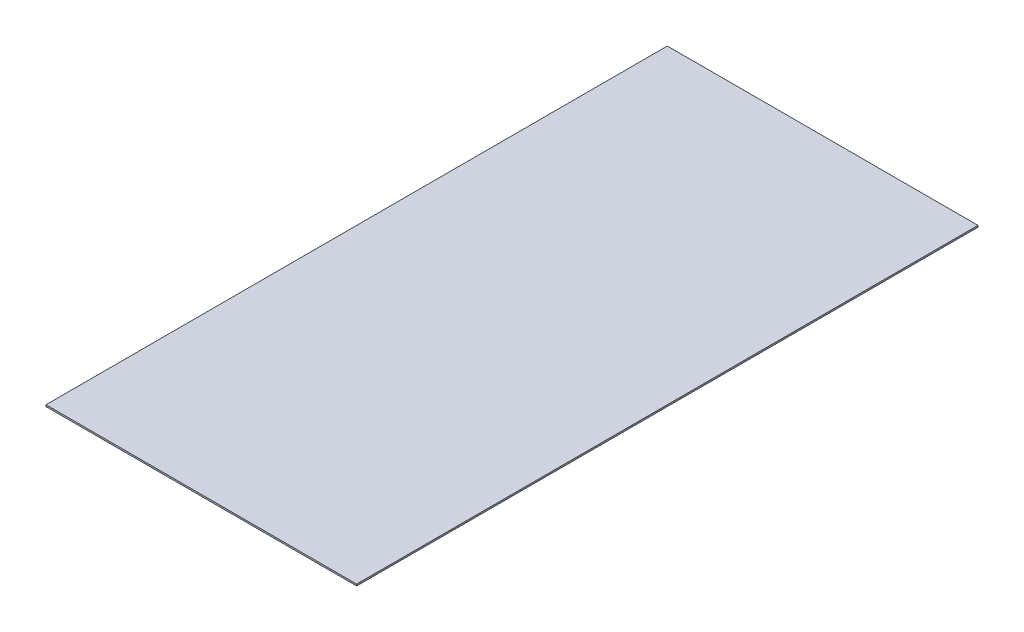
ISO-10303-21;
HEADER;
FILE_DESCRIPTION(('STEP AP214'),'2;1');
FILE_NAME('part.step','',(''),(''),'','','');
FILE_SCHEMA(('AUTOMOTIVE_DESIGN { 1 0 10303 214 1 1 1 1 }'));
ENDSEC;
DATA;
#1=APPLICATION_CONTEXT('core data for automotive mechanical design processes');
#2=APPLICATION_PROTOCOL_DEFINITION('international standard','automotive_design',2000,#1);
#3=PRODUCT_CONTEXT('',#1,'mechanical');
#4=PRODUCT('Part','Part','',(#3));
#5=PRODUCT_RELATED_PRODUCT_CATEGORY('part','',(#4));
#6=PRODUCT_DEFINITION_FORMATION('','',#4);
#7=PRODUCT_DEFINITION_CONTEXT('part definition',#1,'design');
#8=PRODUCT_DEFINITION('design','',#6,#7);
#9=PRODUCT_DEFINITION_SHAPE('','',#8);
#10=(LENGTH_UNIT() NAMED_UNIT(*) SI_UNIT(.MILLI.,.METRE.));
#11=(NAMED_UNIT(*) PLANE_ANGLE_UNIT() SI_UNIT($,.RADIAN.));
#12=(NAMED_UNIT(*) SI_UNIT($,.STERADIAN.) SOLID_ANGLE_UNIT());
#13=UNCERTAINTY_MEASURE_WITH_UNIT(LENGTH_MEASURE(1.E-05),#10,'distance_accuracy_value','');
#14=(GEOMETRIC_REPRESENTATION_CONTEXT(3) GLOBAL_UNCERTAINTY_ASSIGNED_CONTEXT((#13)) GLOBAL_UNIT_ASSIGNED_CONTEXT((#10,
#11,#12)) REPRESENTATION_CONTEXT('',''));
#15=CARTESIAN_POINT('',(0.,0.,0.));
#16=DIRECTION('',(0.,0.,1.));
#17=DIRECTION('',(1.,0.,0.));
#18=AXIS2_PLACEMENT_3D('',#15,#16,#17);
#19=CARTESIAN_POINT('',(609.6,6.4,1219.2));
#20=DIRECTION('',(-1.,0.,0.));
#21=DIRECTION('',(0.,0.,1.));
#22=AXIS2_PLACEMENT_3D('',#19,#20,#21);
#23=PLANE('',#22);
#24=DIRECTION('',(0.,0.,-1.));
#25=VECTOR('',#24,1.);
#26=CARTESIAN_POINT('',(609.6,0.,1219.2));
#27=LINE('',#26,#25);
#28=CARTESIAN_POINT('',(609.6,0.,1219.2));
#29=VERTEX_POINT('',#28);
#30=CARTESIAN_POINT('',(609.6,0.,-1219.2));
#31=VERTEX_POINT('',#30);
#32=EDGE_CURVE('E96',#29,#31,#27,.T.);
#33=ORIENTED_EDGE('',*,*,#32,.T.);
#34=DIRECTION('',(0.,-1.,0.));
#35=VECTOR('',#34,1.);
#36=CARTESIAN_POINT('',(609.6,6.4,-1219.2));
#37=LINE('',#36,#35);
#38=CARTESIAN_POINT('',(609.6,6.4,-1219.2));
#39=VERTEX_POINT('',#38);
#40=EDGE_CURVE('E11',#39,#31,#37,.T.);
#41=ORIENTED_EDGE('',*,*,#40,.F.);
#42=DIRECTION('',(0.,0.,-1.));
#43=VECTOR('',#42,1.);
#44=CARTESIAN_POINT('',(609.6,6.4,1219.2));
#45=LINE('',#44,#43);
#46=CARTESIAN_POINT('',(609.6,6.4,1219.2));
#47=VERTEX_POINT('',#46);
#48=EDGE_CURVE('E84',#47,#39,#45,.T.);
#49=ORIENTED_EDGE('',*,*,#48,.F.);
#50=DIRECTION('',(0.,-1.,0.));
#51=VECTOR('',#50,1.);
#52=CARTESIAN_POINT('',(609.6,6.4,1219.2));
#53=LINE('',#52,#51);
#54=EDGE_CURVE('E92',#47,#29,#53,.T.);
#55=ORIENTED_EDGE('',*,*,#54,.T.);
#56=EDGE_LOOP('',(#33,#41,#49,#55));
#57=FACE_BOUND('',#56,.T.);
#58=ADVANCED_FACE('F33',(#57),#23,.F.);
#59=CARTESIAN_POINT('',(-609.6,6.4,-1219.2));
#60=DIRECTION('',(0.,0.,1.));
#61=DIRECTION('',(1.,0.,0.));
#62=AXIS2_PLACEMENT_3D('',#59,#60,#61);
#63=PLANE('',#62);
#64=DIRECTION('',(-1.,0.,0.));
#65=VECTOR('',#64,1.);
#66=CARTESIAN_POINT('',(-609.6,0.,-1219.2));
#67=LINE('',#66,#65);
#68=CARTESIAN_POINT('',(-609.6,0.,-1219.2));
#69=VERTEX_POINT('',#68);
#70=EDGE_CURVE('E88',#31,#69,#67,.T.);
#71=ORIENTED_EDGE('',*,*,#70,.T.);
#72=DIRECTION('',(0.,-1.,0.));
#73=VECTOR('',#72,1.);
#74=CARTESIAN_POINT('',(-609.6,6.4,-1219.2));
#75=LINE('',#74,#73);
#76=CARTESIAN_POINT('',(-609.6,6.4,-1219.2));
#77=VERTEX_POINT('',#76);
#78=EDGE_CURVE('E41',#77,#69,#75,.T.);
#79=ORIENTED_EDGE('',*,*,#78,.F.);
#80=DIRECTION('',(-1.,0.,0.));
#81=VECTOR('',#80,1.);
#82=CARTESIAN_POINT('',(-609.6,6.4,-1219.2));
#83=LINE('',#82,#81);
#84=EDGE_CURVE('E79',#39,#77,#83,.T.);
#85=ORIENTED_EDGE('',*,*,#84,.F.);
#86=ORIENTED_EDGE('',*,*,#40,.T.);
#87=EDGE_LOOP('',(#71,#79,#85,#86));
#88=FACE_BOUND('',#87,.T.);
#89=ADVANCED_FACE('F87',(#88),#63,.F.);
#90=CARTESIAN_POINT('',(-609.6,6.4,1219.2));
#91=DIRECTION('',(1.,0.,0.));
#92=DIRECTION('',(0.,0.,-1.));
#93=AXIS2_PLACEMENT_3D('',#90,#91,#92);
#94=PLANE('',#93);
#95=DIRECTION('',(0.,0.,1.));
#96=VECTOR('',#95,1.);
#97=CARTESIAN_POINT('',(-609.6,0.,1219.2));
#98=LINE('',#97,#96);
#99=CARTESIAN_POINT('',(-609.6,0.,1219.2));
#100=VERTEX_POINT('',#99);
#101=EDGE_CURVE('E66',#69,#100,#98,.T.);
#102=ORIENTED_EDGE('',*,*,#101,.T.);
#103=DIRECTION('',(0.,-1.,0.));
#104=VECTOR('',#103,1.);
#105=CARTESIAN_POINT('',(-609.6,6.4,1219.2));
#106=LINE('',#105,#104);
#107=CARTESIAN_POINT('',(-609.6,6.4,1219.2));
#108=VERTEX_POINT('',#107);
#109=EDGE_CURVE('E89',#108,#100,#106,.T.);
#110=ORIENTED_EDGE('',*,*,#109,.F.);
#111=DIRECTION('',(0.,0.,1.));
#112=VECTOR('',#111,1.);
#113=CARTESIAN_POINT('',(-609.6,6.4,1219.2));
#114=LINE('',#113,#112);
#115=EDGE_CURVE('E82',#77,#108,#114,.T.);
#116=ORIENTED_EDGE('',*,*,#115,.F.);
#117=ORIENTED_EDGE('',*,*,#78,.T.);
#118=EDGE_LOOP('',(#102,#110,#116,#117));
#119=FACE_BOUND('',#118,.T.);
#120=ADVANCED_FACE('F90',(#119),#94,.F.);
#121=CARTESIAN_POINT('',(-609.6,6.4,1219.2));
#122=DIRECTION('',(0.,0.,-1.));
#123=DIRECTION('',(-1.,0.,0.));
#124=AXIS2_PLACEMENT_3D('',#121,#122,#123);
#125=PLANE('',#124);
#126=DIRECTION('',(1.,0.,0.));
#127=VECTOR('',#126,1.);
#128=CARTESIAN_POINT('',(-609.6,0.,1219.2));
#129=LINE('',#128,#127);
#130=EDGE_CURVE('E72',#100,#29,#129,.T.);
#131=ORIENTED_EDGE('',*,*,#130,.T.);
#132=ORIENTED_EDGE('',*,*,#54,.F.);
#133=DIRECTION('',(1.,0.,0.));
#134=VECTOR('',#133,1.);
#135=CARTESIAN_POINT('',(-609.6,6.4,1219.2));
#136=LINE('',#135,#134);
#137=EDGE_CURVE('E49',#108,#47,#136,.T.);
#138=ORIENTED_EDGE('',*,*,#137,.F.);
#139=ORIENTED_EDGE('',*,*,#109,.T.);
#140=EDGE_LOOP('',(#131,#132,#138,#139));
#141=FACE_BOUND('',#140,.T.);
#142=ADVANCED_FACE('F103',(#141),#125,.F.);
#143=CARTESIAN_POINT('',(0.,6.4,0.));
#144=DIRECTION('',(0.,-1.,0.));
#145=DIRECTION('',(0.,0.,-1.));
#146=AXIS2_PLACEMENT_3D('',#143,#144,#145);
#147=PLANE('',#146);
#148=ORIENTED_EDGE('',*,*,#48,.T.);
#149=ORIENTED_EDGE('',*,*,#84,.T.);
#150=ORIENTED_EDGE('',*,*,#115,.T.);
#151=ORIENTED_EDGE('',*,*,#137,.T.);
#152=EDGE_LOOP('',(#148,#149,#150,#151));
#153=FACE_BOUND('',#152,.T.);
#154=ADVANCED_FACE('F80',(#153),#147,.F.);
#155=CARTESIAN_POINT('',(0.,0.,0.));
#156=DIRECTION('',(0.,-1.,0.));
#157=DIRECTION('',(0.,0.,-1.));
#158=AXIS2_PLACEMENT_3D('',#155,#156,#157);
#159=PLANE('',#158);
#160=ORIENTED_EDGE('',*,*,#32,.F.);
#161=ORIENTED_EDGE('',*,*,#130,.F.);
#162=ORIENTED_EDGE('',*,*,#101,.F.);
#163=ORIENTED_EDGE('',*,*,#70,.F.);
#164=EDGE_LOOP('',(#160,#161,#162,#163));
#165=FACE_BOUND('',#164,.T.);
#166=ADVANCED_FACE('F106',(#165),#159,.T.);
#167=CLOSED_SHELL('',(#58,#89,#120,#142,#154,#166));
#168=MANIFOLD_SOLID_BREP('B2',#167);
#169=ADVANCED_BREP_SHAPE_REPRESENTATION('',(#18,#168),#14);
#170=SHAPE_DEFINITION_REPRESENTATION(#9,#169);
ENDSEC;
END-ISO-10303-21;
